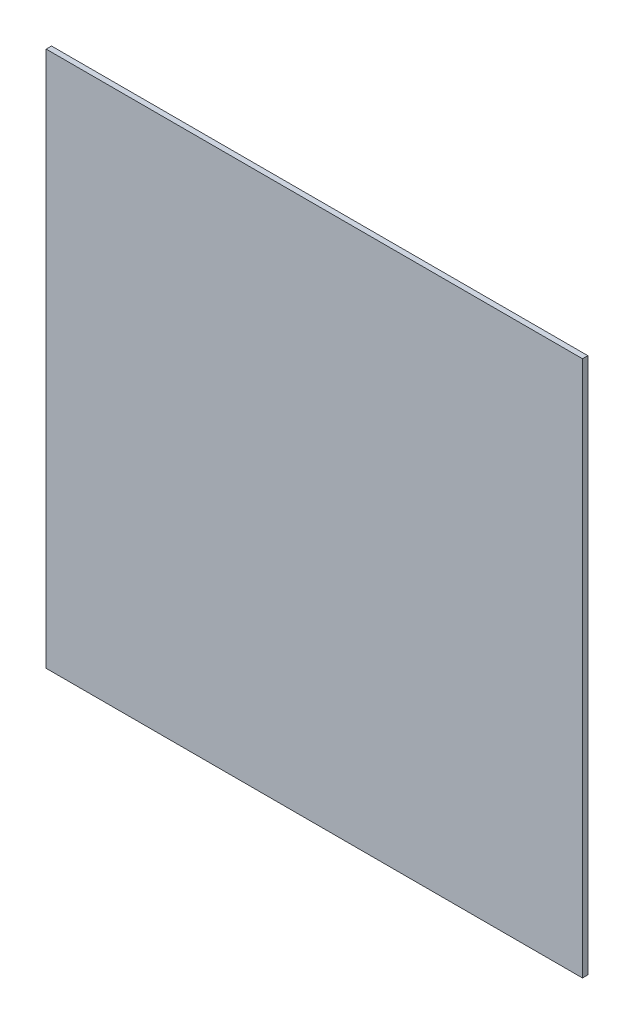
ISO-10303-21;
HEADER;
FILE_DESCRIPTION(('STEP AP214'),'2;1');
FILE_NAME('part.step','',(''),(''),'','','');
FILE_SCHEMA(('AUTOMOTIVE_DESIGN { 1 0 10303 214 1 1 1 1 }'));
ENDSEC;
DATA;
#1=APPLICATION_CONTEXT('core data for automotive mechanical design processes');
#2=APPLICATION_PROTOCOL_DEFINITION('international standard','automotive_design',2000,#1);
#3=PRODUCT_CONTEXT('',#1,'mechanical');
#4=PRODUCT('Part','Part','',(#3));
#5=PRODUCT_RELATED_PRODUCT_CATEGORY('part','',(#4));
#6=PRODUCT_DEFINITION_FORMATION('','',#4);
#7=PRODUCT_DEFINITION_CONTEXT('part definition',#1,'design');
#8=PRODUCT_DEFINITION('design','',#6,#7);
#9=PRODUCT_DEFINITION_SHAPE('','',#8);
#10=(LENGTH_UNIT() NAMED_UNIT(*) SI_UNIT(.MILLI.,.METRE.));
#11=(NAMED_UNIT(*) PLANE_ANGLE_UNIT() SI_UNIT($,.RADIAN.));
#12=(NAMED_UNIT(*) SI_UNIT($,.STERADIAN.) SOLID_ANGLE_UNIT());
#13=UNCERTAINTY_MEASURE_WITH_UNIT(LENGTH_MEASURE(1.E-05),#10,'distance_accuracy_value','');
#14=(GEOMETRIC_REPRESENTATION_CONTEXT(3) GLOBAL_UNCERTAINTY_ASSIGNED_CONTEXT((#13)) GLOBAL_UNIT_ASSIGNED_CONTEXT((#10,
#11,#12)) REPRESENTATION_CONTEXT('',''));
#15=CARTESIAN_POINT('',(0.,0.,0.));
#16=DIRECTION('',(0.,0.,1.));
#17=DIRECTION('',(1.,0.,0.));
#18=AXIS2_PLACEMENT_3D('',#15,#16,#17);
#19=CARTESIAN_POINT('',(1.77635683940025E-12,10000.,-100.));
#20=DIRECTION('',(1.,0.,0.));
#21=DIRECTION('',(0.,1.,0.));
#22=AXIS2_PLACEMENT_3D('',#19,#20,#21);
#23=PLANE('',#22);
#24=DIRECTION('',(0.,1.,0.));
#25=VECTOR('',#24,1.);
#26=CARTESIAN_POINT('',(1.77635683940025E-12,10000.,0.));
#27=LINE('',#26,#25);
#28=CARTESIAN_POINT('',(0.,0.,0.));
#29=VERTEX_POINT('',#28);
#30=CARTESIAN_POINT('',(1.77635683940025E-12,10000.,0.));
#31=VERTEX_POINT('',#30);
#32=EDGE_CURVE('E100',#29,#31,#27,.T.);
#33=ORIENTED_EDGE('',*,*,#32,.T.);
#34=DIRECTION('',(0.,0.,1.));
#35=VECTOR('',#34,1.);
#36=CARTESIAN_POINT('',(1.77635683940025E-12,10000.,-100.));
#37=LINE('',#36,#35);
#38=CARTESIAN_POINT('',(1.77635683940025E-12,10000.,-100.));
#39=VERTEX_POINT('',#38);
#40=EDGE_CURVE('E11',#39,#31,#37,.T.);
#41=ORIENTED_EDGE('',*,*,#40,.F.);
#42=DIRECTION('',(0.,1.,0.));
#43=VECTOR('',#42,1.);
#44=CARTESIAN_POINT('',(1.77635683940025E-12,10000.,-100.));
#45=LINE('',#44,#43);
#46=CARTESIAN_POINT('',(0.,0.,-100.));
#47=VERTEX_POINT('',#46);
#48=EDGE_CURVE('E88',#47,#39,#45,.T.);
#49=ORIENTED_EDGE('',*,*,#48,.F.);
#50=DIRECTION('',(0.,0.,1.));
#51=VECTOR('',#50,1.);
#52=CARTESIAN_POINT('',(0.,0.,-100.));
#53=LINE('',#52,#51);
#54=EDGE_CURVE('E96',#47,#29,#53,.T.);
#55=ORIENTED_EDGE('',*,*,#54,.T.);
#56=EDGE_LOOP('',(#33,#41,#49,#55));
#57=FACE_BOUND('',#56,.T.);
#58=ADVANCED_FACE('F37',(#57),#23,.F.);
#59=CARTESIAN_POINT('',(1.77635683940025E-12,10000.,-100.));
#60=DIRECTION('',(0.,-1.,0.));
#61=DIRECTION('',(0.,0.,-1.));
#62=AXIS2_PLACEMENT_3D('',#59,#60,#61);
#63=PLANE('',#62);
#64=DIRECTION('',(1.,0.,0.));
#65=VECTOR('',#64,1.);
#66=CARTESIAN_POINT('',(1.77635683940025E-12,10000.,0.));
#67=LINE('',#66,#65);
#68=CARTESIAN_POINT('',(10000.,10000.,0.));
#69=VERTEX_POINT('',#68);
#70=EDGE_CURVE('E92',#31,#69,#67,.T.);
#71=ORIENTED_EDGE('',*,*,#70,.T.);
#72=DIRECTION('',(0.,0.,1.));
#73=VECTOR('',#72,1.);
#74=CARTESIAN_POINT('',(10000.,10000.,-100.));
#75=LINE('',#74,#73);
#76=CARTESIAN_POINT('',(10000.,10000.,-100.));
#77=VERTEX_POINT('',#76);
#78=EDGE_CURVE('E45',#77,#69,#75,.T.);
#79=ORIENTED_EDGE('',*,*,#78,.F.);
#80=DIRECTION('',(1.,0.,0.));
#81=VECTOR('',#80,1.);
#82=CARTESIAN_POINT('',(1.77635683940025E-12,10000.,-100.));
#83=LINE('',#82,#81);
#84=EDGE_CURVE('E83',#39,#77,#83,.T.);
#85=ORIENTED_EDGE('',*,*,#84,.F.);
#86=ORIENTED_EDGE('',*,*,#40,.T.);
#87=EDGE_LOOP('',(#71,#79,#85,#86));
#88=FACE_BOUND('',#87,.T.);
#89=ADVANCED_FACE('F91',(#88),#63,.F.);
#90=CARTESIAN_POINT('',(10000.,10000.,-100.));
#91=DIRECTION('',(-1.,0.,0.));
#92=DIRECTION('',(0.,0.,1.));
#93=AXIS2_PLACEMENT_3D('',#90,#91,#92);
#94=PLANE('',#93);
#95=DIRECTION('',(0.,-1.,0.));
#96=VECTOR('',#95,1.);
#97=CARTESIAN_POINT('',(10000.,10000.,0.));
#98=LINE('',#97,#96);
#99=CARTESIAN_POINT('',(10000.,0.,0.));
#100=VERTEX_POINT('',#99);
#101=EDGE_CURVE('E70',#69,#100,#98,.T.);
#102=ORIENTED_EDGE('',*,*,#101,.T.);
#103=DIRECTION('',(0.,0.,1.));
#104=VECTOR('',#103,1.);
#105=CARTESIAN_POINT('',(10000.,0.,-100.));
#106=LINE('',#105,#104);
#107=CARTESIAN_POINT('',(10000.,0.,-100.));
#108=VERTEX_POINT('',#107);
#109=EDGE_CURVE('E93',#108,#100,#106,.T.);
#110=ORIENTED_EDGE('',*,*,#109,.F.);
#111=DIRECTION('',(0.,-1.,0.));
#112=VECTOR('',#111,1.);
#113=CARTESIAN_POINT('',(10000.,10000.,-100.));
#114=LINE('',#113,#112);
#115=EDGE_CURVE('E86',#77,#108,#114,.T.);
#116=ORIENTED_EDGE('',*,*,#115,.F.);
#117=ORIENTED_EDGE('',*,*,#78,.T.);
#118=EDGE_LOOP('',(#102,#110,#116,#117));
#119=FACE_BOUND('',#118,.T.);
#120=ADVANCED_FACE('F94',(#119),#94,.F.);
#121=CARTESIAN_POINT('',(0.,0.,-100.));
#122=DIRECTION('',(0.,1.,0.));
#123=DIRECTION('',(0.,0.,1.));
#124=AXIS2_PLACEMENT_3D('',#121,#122,#123);
#125=PLANE('',#124);
#126=DIRECTION('',(-1.,0.,0.));
#127=VECTOR('',#126,1.);
#128=CARTESIAN_POINT('',(0.,0.,0.));
#129=LINE('',#128,#127);
#130=EDGE_CURVE('E76',#100,#29,#129,.T.);
#131=ORIENTED_EDGE('',*,*,#130,.T.);
#132=ORIENTED_EDGE('',*,*,#54,.F.);
#133=DIRECTION('',(-1.,0.,0.));
#134=VECTOR('',#133,1.);
#135=CARTESIAN_POINT('',(0.,0.,-100.));
#136=LINE('',#135,#134);
#137=EDGE_CURVE('E53',#108,#47,#136,.T.);
#138=ORIENTED_EDGE('',*,*,#137,.F.);
#139=ORIENTED_EDGE('',*,*,#109,.T.);
#140=EDGE_LOOP('',(#131,#132,#138,#139));
#141=FACE_BOUND('',#140,.T.);
#142=ADVANCED_FACE('F107',(#141),#125,.F.);
#143=CARTESIAN_POINT('',(0.,0.,-100.));
#144=DIRECTION('',(0.,0.,1.));
#145=DIRECTION('',(1.,0.,0.));
#146=AXIS2_PLACEMENT_3D('',#143,#144,#145);
#147=PLANE('',#146);
#148=ORIENTED_EDGE('',*,*,#48,.T.);
#149=ORIENTED_EDGE('',*,*,#84,.T.);
#150=ORIENTED_EDGE('',*,*,#115,.T.);
#151=ORIENTED_EDGE('',*,*,#137,.T.);
#152=EDGE_LOOP('',(#148,#149,#150,#151));
#153=FACE_BOUND('',#152,.T.);
#154=ADVANCED_FACE('F84',(#153),#147,.F.);
#155=CARTESIAN_POINT('',(0.,0.,0.));
#156=DIRECTION('',(0.,0.,1.));
#157=DIRECTION('',(1.,0.,0.));
#158=AXIS2_PLACEMENT_3D('',#155,#156,#157);
#159=PLANE('',#158);
#160=ORIENTED_EDGE('',*,*,#32,.F.);
#161=ORIENTED_EDGE('',*,*,#130,.F.);
#162=ORIENTED_EDGE('',*,*,#101,.F.);
#163=ORIENTED_EDGE('',*,*,#70,.F.);
#164=EDGE_LOOP('',(#160,#161,#162,#163));
#165=FACE_BOUND('',#164,.T.);
#166=ADVANCED_FACE('F110',(#165),#159,.T.);
#167=CLOSED_SHELL('',(#58,#89,#120,#142,#154,#166));
#168=MANIFOLD_SOLID_BREP('B2',#167);
#169=ADVANCED_BREP_SHAPE_REPRESENTATION('',(#18,#168),#14);
#170=SHAPE_DEFINITION_REPRESENTATION(#9,#169);
ENDSEC;
END-ISO-10303-21;
